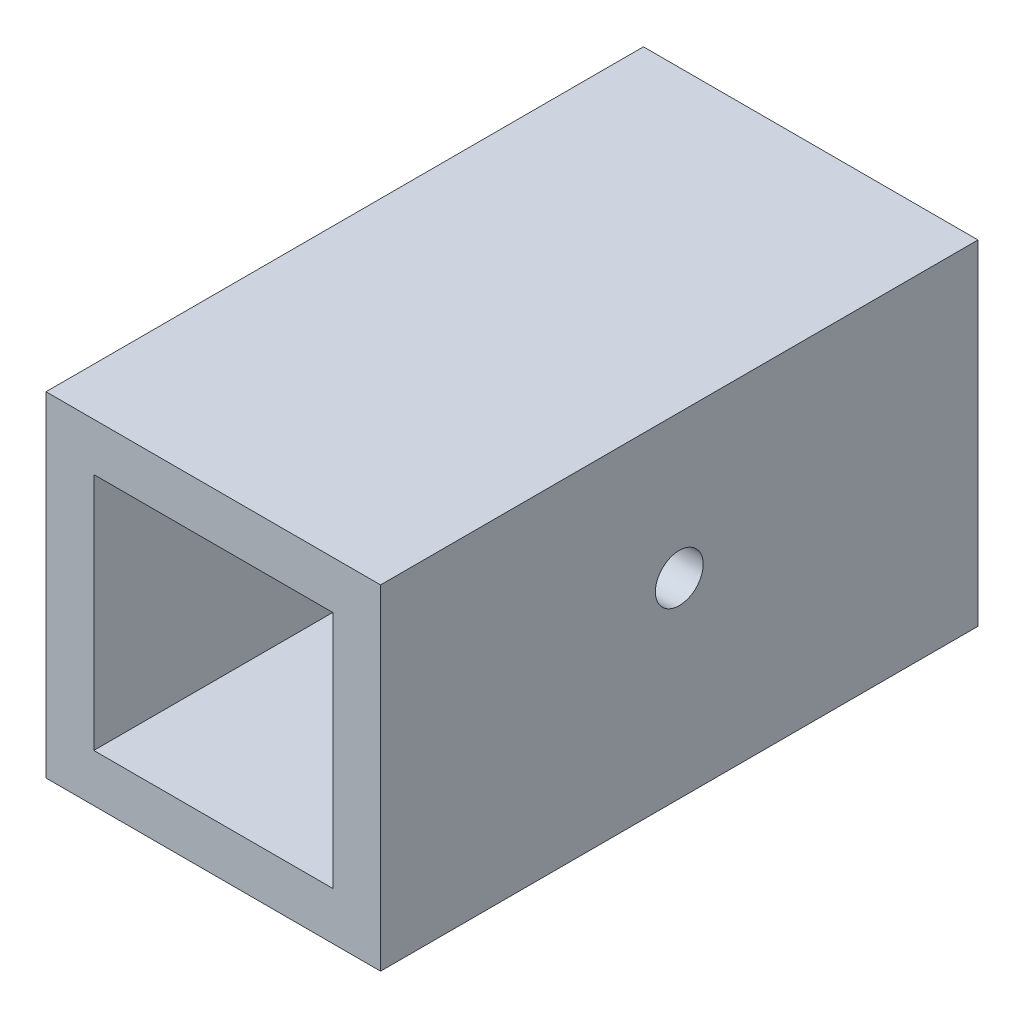
ISO-10303-21;
HEADER;
FILE_DESCRIPTION(('STEP AP214'),'2;1');
FILE_NAME('part.step','',(''),(''),'','','');
FILE_SCHEMA(('AUTOMOTIVE_DESIGN { 1 0 10303 214 1 1 1 1 }'));
ENDSEC;
DATA;
#1=APPLICATION_CONTEXT('core data for automotive mechanical design processes');
#2=APPLICATION_PROTOCOL_DEFINITION('international standard','automotive_design',2000,#1);
#3=PRODUCT_CONTEXT('',#1,'mechanical');
#4=PRODUCT('Part','Part','',(#3));
#5=PRODUCT_RELATED_PRODUCT_CATEGORY('part','',(#4));
#6=PRODUCT_DEFINITION_FORMATION('','',#4);
#7=PRODUCT_DEFINITION_CONTEXT('part definition',#1,'design');
#8=PRODUCT_DEFINITION('design','',#6,#7);
#9=PRODUCT_DEFINITION_SHAPE('','',#8);
#10=(LENGTH_UNIT() NAMED_UNIT(*) SI_UNIT(.MILLI.,.METRE.));
#11=(NAMED_UNIT(*) PLANE_ANGLE_UNIT() SI_UNIT($,.RADIAN.));
#12=(NAMED_UNIT(*) SI_UNIT($,.STERADIAN.) SOLID_ANGLE_UNIT());
#13=UNCERTAINTY_MEASURE_WITH_UNIT(LENGTH_MEASURE(1.E-05),#10,'distance_accuracy_value','');
#14=(GEOMETRIC_REPRESENTATION_CONTEXT(3) GLOBAL_UNCERTAINTY_ASSIGNED_CONTEXT((#13)) GLOBAL_UNIT_ASSIGNED_CONTEXT((#10,
#11,#12)) REPRESENTATION_CONTEXT('',''));
#15=CARTESIAN_POINT('',(0.,0.,0.));
#16=DIRECTION('',(0.,0.,1.));
#17=DIRECTION('',(1.,0.,0.));
#18=AXIS2_PLACEMENT_3D('',#15,#16,#17);
#19=CARTESIAN_POINT('',(0.,0.,0.));
#20=DIRECTION('',(0.,0.,-1.));
#21=DIRECTION('',(-1.,0.,0.));
#22=AXIS2_PLACEMENT_3D('',#19,#20,#21);
#23=PLANE('',#22);
#24=DIRECTION('',(0.,-1.,0.));
#25=VECTOR('',#24,1.);
#26=CARTESIAN_POINT('',(0.,0.,0.));
#27=LINE('',#26,#25);
#28=CARTESIAN_POINT('',(0.,14.,0.));
#29=VERTEX_POINT('',#28);
#30=CARTESIAN_POINT('',(0.,0.,0.));
#31=VERTEX_POINT('',#30);
#32=EDGE_CURVE('E240',#29,#31,#27,.T.);
#33=ORIENTED_EDGE('',*,*,#32,.F.);
#34=DIRECTION('',(-1.,0.,0.));
#35=VECTOR('',#34,1.);
#36=CARTESIAN_POINT('',(0.,14.,0.));
#37=LINE('',#36,#35);
#38=CARTESIAN_POINT('',(14.,14.,0.));
#39=VERTEX_POINT('',#38);
#40=EDGE_CURVE('E250',#39,#29,#37,.T.);
#41=ORIENTED_EDGE('',*,*,#40,.F.);
#42=DIRECTION('',(0.,1.,0.));
#43=VECTOR('',#42,1.);
#44=CARTESIAN_POINT('',(14.,0.,0.));
#45=LINE('',#44,#43);
#46=CARTESIAN_POINT('',(14.,0.,0.));
#47=VERTEX_POINT('',#46);
#48=EDGE_CURVE('E247',#47,#39,#45,.T.);
#49=ORIENTED_EDGE('',*,*,#48,.F.);
#50=DIRECTION('',(1.,0.,0.));
#51=VECTOR('',#50,1.);
#52=CARTESIAN_POINT('',(0.,0.,0.));
#53=LINE('',#52,#51);
#54=EDGE_CURVE('E244',#31,#47,#53,.T.);
#55=ORIENTED_EDGE('',*,*,#54,.F.);
#56=EDGE_LOOP('',(#33,#41,#49,#55));
#57=FACE_BOUND('',#56,.T.);
#58=DIRECTION('',(-1.,0.,0.));
#59=VECTOR('',#58,1.);
#60=CARTESIAN_POINT('',(2.,12.,0.));
#61=LINE('',#60,#59);
#62=CARTESIAN_POINT('',(12.,12.,0.));
#63=VERTEX_POINT('',#62);
#64=CARTESIAN_POINT('',(2.,12.,0.));
#65=VERTEX_POINT('',#64);
#66=EDGE_CURVE('E200',#63,#65,#61,.T.);
#67=ORIENTED_EDGE('',*,*,#66,.T.);
#68=DIRECTION('',(0.,-1.,0.));
#69=VECTOR('',#68,1.);
#70=CARTESIAN_POINT('',(2.,2.,0.));
#71=LINE('',#70,#69);
#72=CARTESIAN_POINT('',(2.,2.,0.));
#73=VERTEX_POINT('',#72);
#74=EDGE_CURVE('E194',#65,#73,#71,.T.);
#75=ORIENTED_EDGE('',*,*,#74,.T.);
#76=DIRECTION('',(1.,0.,0.));
#77=VECTOR('',#76,1.);
#78=CARTESIAN_POINT('',(2.,2.,0.));
#79=LINE('',#78,#77);
#80=CARTESIAN_POINT('',(12.,2.,0.));
#81=VERTEX_POINT('',#80);
#82=EDGE_CURVE('E216',#73,#81,#79,.T.);
#83=ORIENTED_EDGE('',*,*,#82,.T.);
#84=DIRECTION('',(0.,1.,0.));
#85=VECTOR('',#84,1.);
#86=CARTESIAN_POINT('',(12.,2.,0.));
#87=LINE('',#86,#85);
#88=EDGE_CURVE('E220',#81,#63,#87,.T.);
#89=ORIENTED_EDGE('',*,*,#88,.T.);
#90=EDGE_LOOP('',(#67,#75,#83,#89));
#91=FACE_BOUND('',#90,.T.);
#92=ADVANCED_FACE('F39',(#57,#91),#23,.T.);
#93=CARTESIAN_POINT('',(0.,0.,10.));
#94=DIRECTION('',(1.,0.,0.));
#95=DIRECTION('',(0.,0.,-1.));
#96=AXIS2_PLACEMENT_3D('',#93,#94,#95);
#97=PLANE('',#96);
#98=CARTESIAN_POINT('',(0.,8.,12.5));
#99=DIRECTION('',(1.,0.,0.));
#100=DIRECTION('',(0.,0.,-1.));
#101=AXIS2_PLACEMENT_3D('',#98,#99,#100);
#102=CIRCLE('',#101,1.);
#103=CARTESIAN_POINT('',(0.,8.,11.5));
#104=VERTEX_POINT('',#103);
#105=EDGE_CURVE('E163',#104,#104,#102,.T.);
#106=ORIENTED_EDGE('',*,*,#105,.T.);
#107=EDGE_LOOP('',(#106));
#108=FACE_BOUND('',#107,.T.);
#109=ORIENTED_EDGE('',*,*,#32,.T.);
#110=DIRECTION('',(0.,0.,-1.));
#111=VECTOR('',#110,1.);
#112=CARTESIAN_POINT('',(0.,0.,10.));
#113=LINE('',#112,#111);
#114=CARTESIAN_POINT('',(0.,0.,25.));
#115=VERTEX_POINT('',#114);
#116=EDGE_CURVE('E11',#115,#31,#113,.T.);
#117=ORIENTED_EDGE('',*,*,#116,.F.);
#118=DIRECTION('',(0.,-1.,0.));
#119=VECTOR('',#118,1.);
#120=CARTESIAN_POINT('',(0.,14.,25.));
#121=LINE('',#120,#119);
#122=CARTESIAN_POINT('',(0.,14.,25.));
#123=VERTEX_POINT('',#122);
#124=EDGE_CURVE('E145',#123,#115,#121,.T.);
#125=ORIENTED_EDGE('',*,*,#124,.F.);
#126=DIRECTION('',(0.,0.,-1.));
#127=VECTOR('',#126,1.);
#128=CARTESIAN_POINT('',(0.,14.,10.));
#129=LINE('',#128,#127);
#130=EDGE_CURVE('E253',#123,#29,#129,.T.);
#131=ORIENTED_EDGE('',*,*,#130,.T.);
#132=EDGE_LOOP('',(#109,#117,#125,#131));
#133=FACE_BOUND('',#132,.T.);
#134=ADVANCED_FACE('F41',(#108,#133),#97,.F.);
#135=CARTESIAN_POINT('',(0.,0.,10.));
#136=DIRECTION('',(0.,1.,0.));
#137=DIRECTION('',(0.,0.,1.));
#138=AXIS2_PLACEMENT_3D('',#135,#136,#137);
#139=PLANE('',#138);
#140=ORIENTED_EDGE('',*,*,#54,.T.);
#141=DIRECTION('',(0.,0.,-1.));
#142=VECTOR('',#141,1.);
#143=CARTESIAN_POINT('',(14.,0.,10.));
#144=LINE('',#143,#142);
#145=CARTESIAN_POINT('',(14.,0.,25.));
#146=VERTEX_POINT('',#145);
#147=EDGE_CURVE('E48',#146,#47,#144,.T.);
#148=ORIENTED_EDGE('',*,*,#147,.F.);
#149=DIRECTION('',(1.,0.,0.));
#150=VECTOR('',#149,1.);
#151=CARTESIAN_POINT('',(0.,0.,25.));
#152=LINE('',#151,#150);
#153=EDGE_CURVE('E182',#115,#146,#152,.T.);
#154=ORIENTED_EDGE('',*,*,#153,.F.);
#155=ORIENTED_EDGE('',*,*,#116,.T.);
#156=EDGE_LOOP('',(#140,#148,#154,#155));
#157=FACE_BOUND('',#156,.T.);
#158=ADVANCED_FACE('F278',(#157),#139,.F.);
#159=CARTESIAN_POINT('',(14.,0.,10.));
#160=DIRECTION('',(-1.,0.,0.));
#161=DIRECTION('',(0.,0.,1.));
#162=AXIS2_PLACEMENT_3D('',#159,#160,#161);
#163=PLANE('',#162);
#164=CARTESIAN_POINT('',(14.,8.,12.5));
#165=DIRECTION('',(1.,0.,0.));
#166=DIRECTION('',(0.,0.,-1.));
#167=AXIS2_PLACEMENT_3D('',#164,#165,#166);
#168=CIRCLE('',#167,1.);
#169=CARTESIAN_POINT('',(14.,8.,11.5));
#170=VERTEX_POINT('',#169);
#171=EDGE_CURVE('E431',#170,#170,#168,.T.);
#172=ORIENTED_EDGE('',*,*,#171,.F.);
#173=EDGE_LOOP('',(#172));
#174=FACE_BOUND('',#173,.T.);
#175=ORIENTED_EDGE('',*,*,#48,.T.);
#176=DIRECTION('',(0.,0.,-1.));
#177=VECTOR('',#176,1.);
#178=CARTESIAN_POINT('',(14.,14.,10.));
#179=LINE('',#178,#177);
#180=CARTESIAN_POINT('',(14.,14.,25.));
#181=VERTEX_POINT('',#180);
#182=EDGE_CURVE('E257',#181,#39,#179,.T.);
#183=ORIENTED_EDGE('',*,*,#182,.F.);
#184=DIRECTION('',(0.,1.,0.));
#185=VECTOR('',#184,1.);
#186=CARTESIAN_POINT('',(14.,14.,25.));
#187=LINE('',#186,#185);
#188=EDGE_CURVE('E186',#146,#181,#187,.T.);
#189=ORIENTED_EDGE('',*,*,#188,.F.);
#190=ORIENTED_EDGE('',*,*,#147,.T.);
#191=EDGE_LOOP('',(#175,#183,#189,#190));
#192=FACE_BOUND('',#191,.T.);
#193=ADVANCED_FACE('F265',(#174,#192),#163,.F.);
#194=CARTESIAN_POINT('',(0.,14.,10.));
#195=DIRECTION('',(0.,-1.,0.));
#196=DIRECTION('',(0.,0.,-1.));
#197=AXIS2_PLACEMENT_3D('',#194,#195,#196);
#198=PLANE('',#197);
#199=ORIENTED_EDGE('',*,*,#40,.T.);
#200=ORIENTED_EDGE('',*,*,#130,.F.);
#201=DIRECTION('',(-1.,0.,0.));
#202=VECTOR('',#201,1.);
#203=CARTESIAN_POINT('',(0.,14.,25.));
#204=LINE('',#203,#202);
#205=EDGE_CURVE('E190',#181,#123,#204,.T.);
#206=ORIENTED_EDGE('',*,*,#205,.F.);
#207=ORIENTED_EDGE('',*,*,#182,.T.);
#208=EDGE_LOOP('',(#199,#200,#206,#207));
#209=FACE_BOUND('',#208,.T.);
#210=ADVANCED_FACE('F273',(#209),#198,.F.);
#211=CARTESIAN_POINT('',(2.,2.,10.));
#212=DIRECTION('',(1.,0.,0.));
#213=DIRECTION('',(0.,0.,-1.));
#214=AXIS2_PLACEMENT_3D('',#211,#212,#213);
#215=PLANE('',#214);
#216=ORIENTED_EDGE('',*,*,#74,.F.);
#217=DIRECTION('',(0.,0.,-1.));
#218=VECTOR('',#217,1.);
#219=CARTESIAN_POINT('',(2.,12.,10.));
#220=LINE('',#219,#218);
#221=CARTESIAN_POINT('',(2.,12.,10.));
#222=VERTEX_POINT('',#221);
#223=EDGE_CURVE('E212',#222,#65,#220,.T.);
#224=ORIENTED_EDGE('',*,*,#223,.F.);
#225=DIRECTION('',(0.,-1.,0.));
#226=VECTOR('',#225,1.);
#227=CARTESIAN_POINT('',(2.,2.,10.));
#228=LINE('',#227,#226);
#229=CARTESIAN_POINT('',(2.,2.,10.));
#230=VERTEX_POINT('',#229);
#231=EDGE_CURVE('E195',#222,#230,#228,.T.);
#232=ORIENTED_EDGE('',*,*,#231,.T.);
#233=DIRECTION('',(0.,0.,-1.));
#234=VECTOR('',#233,1.);
#235=CARTESIAN_POINT('',(2.,2.,10.));
#236=LINE('',#235,#234);
#237=EDGE_CURVE('E236',#230,#73,#236,.T.);
#238=ORIENTED_EDGE('',*,*,#237,.T.);
#239=EDGE_LOOP('',(#216,#224,#232,#238));
#240=FACE_BOUND('',#239,.T.);
#241=ADVANCED_FACE('F293',(#240),#215,.T.);
#242=CARTESIAN_POINT('',(2.,2.,10.));
#243=DIRECTION('',(0.,1.,0.));
#244=DIRECTION('',(0.,0.,1.));
#245=AXIS2_PLACEMENT_3D('',#242,#243,#244);
#246=PLANE('',#245);
#247=ORIENTED_EDGE('',*,*,#82,.F.);
#248=ORIENTED_EDGE('',*,*,#237,.F.);
#249=DIRECTION('',(1.,0.,0.));
#250=VECTOR('',#249,1.);
#251=CARTESIAN_POINT('',(2.,2.,10.));
#252=LINE('',#251,#250);
#253=CARTESIAN_POINT('',(12.,2.,10.));
#254=VERTEX_POINT('',#253);
#255=EDGE_CURVE('E199',#230,#254,#252,.T.);
#256=ORIENTED_EDGE('',*,*,#255,.T.);
#257=DIRECTION('',(0.,0.,-1.));
#258=VECTOR('',#257,1.);
#259=CARTESIAN_POINT('',(12.,2.,10.));
#260=LINE('',#259,#258);
#261=EDGE_CURVE('E233',#254,#81,#260,.T.);
#262=ORIENTED_EDGE('',*,*,#261,.T.);
#263=EDGE_LOOP('',(#247,#248,#256,#262));
#264=FACE_BOUND('',#263,.T.);
#265=ADVANCED_FACE('F299',(#264),#246,.T.);
#266=CARTESIAN_POINT('',(12.,2.,10.));
#267=DIRECTION('',(-1.,0.,0.));
#268=DIRECTION('',(0.,0.,1.));
#269=AXIS2_PLACEMENT_3D('',#266,#267,#268);
#270=PLANE('',#269);
#271=ORIENTED_EDGE('',*,*,#88,.F.);
#272=ORIENTED_EDGE('',*,*,#261,.F.);
#273=DIRECTION('',(0.,1.,0.));
#274=VECTOR('',#273,1.);
#275=CARTESIAN_POINT('',(12.,2.,10.));
#276=LINE('',#275,#274);
#277=CARTESIAN_POINT('',(12.,12.,10.));
#278=VERTEX_POINT('',#277);
#279=EDGE_CURVE('E204',#254,#278,#276,.T.);
#280=ORIENTED_EDGE('',*,*,#279,.T.);
#281=DIRECTION('',(0.,0.,-1.));
#282=VECTOR('',#281,1.);
#283=CARTESIAN_POINT('',(12.,12.,10.));
#284=LINE('',#283,#282);
#285=EDGE_CURVE('E230',#278,#63,#284,.T.);
#286=ORIENTED_EDGE('',*,*,#285,.T.);
#287=EDGE_LOOP('',(#271,#272,#280,#286));
#288=FACE_BOUND('',#287,.T.);
#289=ADVANCED_FACE('F304',(#288),#270,.T.);
#290=CARTESIAN_POINT('',(2.,12.,10.));
#291=DIRECTION('',(0.,-1.,0.));
#292=DIRECTION('',(0.,0.,-1.));
#293=AXIS2_PLACEMENT_3D('',#290,#291,#292);
#294=PLANE('',#293);
#295=ORIENTED_EDGE('',*,*,#66,.F.);
#296=ORIENTED_EDGE('',*,*,#285,.F.);
#297=DIRECTION('',(-1.,0.,0.));
#298=VECTOR('',#297,1.);
#299=CARTESIAN_POINT('',(2.,12.,10.));
#300=LINE('',#299,#298);
#301=EDGE_CURVE('E208',#278,#222,#300,.T.);
#302=ORIENTED_EDGE('',*,*,#301,.T.);
#303=ORIENTED_EDGE('',*,*,#223,.T.);
#304=EDGE_LOOP('',(#295,#296,#302,#303));
#305=FACE_BOUND('',#304,.T.);
#306=ADVANCED_FACE('F310',(#305),#294,.T.);
#307=CARTESIAN_POINT('',(0.,0.,10.));
#308=DIRECTION('',(0.,0.,1.));
#309=DIRECTION('',(1.,0.,0.));
#310=AXIS2_PLACEMENT_3D('',#307,#308,#309);
#311=PLANE('',#310);
#312=ORIENTED_EDGE('',*,*,#231,.F.);
#313=ORIENTED_EDGE('',*,*,#301,.F.);
#314=ORIENTED_EDGE('',*,*,#279,.F.);
#315=ORIENTED_EDGE('',*,*,#255,.F.);
#316=EDGE_LOOP('',(#312,#313,#314,#315));
#317=FACE_BOUND('',#316,.T.);
#318=ADVANCED_FACE('F316',(#317),#311,.F.);
#319=CARTESIAN_POINT('',(0.,0.,25.));
#320=DIRECTION('',(0.,0.,1.));
#321=DIRECTION('',(1.,0.,0.));
#322=AXIS2_PLACEMENT_3D('',#319,#320,#321);
#323=PLANE('',#322);
#324=ORIENTED_EDGE('',*,*,#124,.T.);
#325=ORIENTED_EDGE('',*,*,#153,.T.);
#326=ORIENTED_EDGE('',*,*,#188,.T.);
#327=ORIENTED_EDGE('',*,*,#205,.T.);
#328=EDGE_LOOP('',(#324,#325,#326,#327));
#329=FACE_BOUND('',#328,.T.);
#330=DIRECTION('',(1.,0.,0.));
#331=VECTOR('',#330,1.);
#332=CARTESIAN_POINT('',(2.,2.,25.));
#333=LINE('',#332,#331);
#334=CARTESIAN_POINT('',(2.,2.,25.));
#335=VERTEX_POINT('',#334);
#336=CARTESIAN_POINT('',(12.,2.,25.));
#337=VERTEX_POINT('',#336);
#338=EDGE_CURVE('E138',#335,#337,#333,.T.);
#339=ORIENTED_EDGE('',*,*,#338,.F.);
#340=DIRECTION('',(0.,-1.,0.));
#341=VECTOR('',#340,1.);
#342=CARTESIAN_POINT('',(2.,12.,25.));
#343=LINE('',#342,#341);
#344=CARTESIAN_POINT('',(2.,12.,25.));
#345=VERTEX_POINT('',#344);
#346=EDGE_CURVE('E128',#345,#335,#343,.T.);
#347=ORIENTED_EDGE('',*,*,#346,.F.);
#348=DIRECTION('',(-1.,0.,0.));
#349=VECTOR('',#348,1.);
#350=CARTESIAN_POINT('',(2.,12.,25.));
#351=LINE('',#350,#349);
#352=CARTESIAN_POINT('',(12.,12.,25.));
#353=VERTEX_POINT('',#352);
#354=EDGE_CURVE('E155',#353,#345,#351,.T.);
#355=ORIENTED_EDGE('',*,*,#354,.F.);
#356=DIRECTION('',(0.,1.,0.));
#357=VECTOR('',#356,1.);
#358=CARTESIAN_POINT('',(12.,12.,25.));
#359=LINE('',#358,#357);
#360=EDGE_CURVE('E151',#337,#353,#359,.T.);
#361=ORIENTED_EDGE('',*,*,#360,.F.);
#362=EDGE_LOOP('',(#339,#347,#355,#361));
#363=FACE_BOUND('',#362,.T.);
#364=ADVANCED_FACE('F149',(#329,#363),#323,.T.);
#365=CARTESIAN_POINT('',(2.,12.,25.));
#366=DIRECTION('',(1.,0.,0.));
#367=DIRECTION('',(0.,1.,0.));
#368=AXIS2_PLACEMENT_3D('',#365,#366,#367);
#369=PLANE('',#368);
#370=DIRECTION('',(0.,-1.,0.));
#371=VECTOR('',#370,1.);
#372=CARTESIAN_POINT('',(2.,12.,15.));
#373=LINE('',#372,#371);
#374=CARTESIAN_POINT('',(2.,12.,15.));
#375=VERTEX_POINT('',#374);
#376=CARTESIAN_POINT('',(2.,2.,15.));
#377=VERTEX_POINT('',#376);
#378=EDGE_CURVE('E55',#375,#377,#373,.T.);
#379=ORIENTED_EDGE('',*,*,#378,.F.);
#380=DIRECTION('',(0.,0.,-1.));
#381=VECTOR('',#380,1.);
#382=CARTESIAN_POINT('',(2.,12.,25.));
#383=LINE('',#382,#381);
#384=EDGE_CURVE('E133',#345,#375,#383,.T.);
#385=ORIENTED_EDGE('',*,*,#384,.F.);
#386=ORIENTED_EDGE('',*,*,#346,.T.);
#387=DIRECTION('',(0.,0.,-1.));
#388=VECTOR('',#387,1.);
#389=CARTESIAN_POINT('',(2.,2.,25.));
#390=LINE('',#389,#388);
#391=EDGE_CURVE('E131',#335,#377,#390,.T.);
#392=ORIENTED_EDGE('',*,*,#391,.T.);
#393=EDGE_LOOP('',(#379,#385,#386,#392));
#394=FACE_BOUND('',#393,.T.);
#395=ADVANCED_FACE('F130',(#394),#369,.T.);
#396=CARTESIAN_POINT('',(2.,2.,25.));
#397=DIRECTION('',(0.,1.,0.));
#398=DIRECTION('',(0.,0.,1.));
#399=AXIS2_PLACEMENT_3D('',#396,#397,#398);
#400=PLANE('',#399);
#401=DIRECTION('',(1.,0.,0.));
#402=VECTOR('',#401,1.);
#403=CARTESIAN_POINT('',(2.,2.,15.));
#404=LINE('',#403,#402);
#405=CARTESIAN_POINT('',(12.,2.,15.));
#406=VERTEX_POINT('',#405);
#407=EDGE_CURVE('E59',#377,#406,#404,.T.);
#408=ORIENTED_EDGE('',*,*,#407,.F.);
#409=ORIENTED_EDGE('',*,*,#391,.F.);
#410=ORIENTED_EDGE('',*,*,#338,.T.);
#411=DIRECTION('',(0.,0.,-1.));
#412=VECTOR('',#411,1.);
#413=CARTESIAN_POINT('',(12.,2.,25.));
#414=LINE('',#413,#412);
#415=EDGE_CURVE('E146',#337,#406,#414,.T.);
#416=ORIENTED_EDGE('',*,*,#415,.T.);
#417=EDGE_LOOP('',(#408,#409,#410,#416));
#418=FACE_BOUND('',#417,.T.);
#419=ADVANCED_FACE('F142',(#418),#400,.T.);
#420=CARTESIAN_POINT('',(12.,12.,25.));
#421=DIRECTION('',(-1.,0.,0.));
#422=DIRECTION('',(0.,-1.,0.));
#423=AXIS2_PLACEMENT_3D('',#420,#421,#422);
#424=PLANE('',#423);
#425=DIRECTION('',(0.,1.,0.));
#426=VECTOR('',#425,1.);
#427=CARTESIAN_POINT('',(12.,12.,15.));
#428=LINE('',#427,#426);
#429=CARTESIAN_POINT('',(12.,12.,15.));
#430=VERTEX_POINT('',#429);
#431=EDGE_CURVE('E166',#406,#430,#428,.T.);
#432=ORIENTED_EDGE('',*,*,#431,.F.);
#433=ORIENTED_EDGE('',*,*,#415,.F.);
#434=ORIENTED_EDGE('',*,*,#360,.T.);
#435=DIRECTION('',(0.,0.,-1.));
#436=VECTOR('',#435,1.);
#437=CARTESIAN_POINT('',(12.,12.,25.));
#438=LINE('',#437,#436);
#439=EDGE_CURVE('E173',#353,#430,#438,.T.);
#440=ORIENTED_EDGE('',*,*,#439,.T.);
#441=EDGE_LOOP('',(#432,#433,#434,#440));
#442=FACE_BOUND('',#441,.T.);
#443=ADVANCED_FACE('F378',(#442),#424,.T.);
#444=CARTESIAN_POINT('',(2.,12.,25.));
#445=DIRECTION('',(0.,-1.,0.));
#446=DIRECTION('',(0.,0.,-1.));
#447=AXIS2_PLACEMENT_3D('',#444,#445,#446);
#448=PLANE('',#447);
#449=DIRECTION('',(-1.,0.,0.));
#450=VECTOR('',#449,1.);
#451=CARTESIAN_POINT('',(2.,12.,15.));
#452=LINE('',#451,#450);
#453=EDGE_CURVE('E139',#430,#375,#452,.T.);
#454=ORIENTED_EDGE('',*,*,#453,.F.);
#455=ORIENTED_EDGE('',*,*,#439,.F.);
#456=ORIENTED_EDGE('',*,*,#354,.T.);
#457=ORIENTED_EDGE('',*,*,#384,.T.);
#458=EDGE_LOOP('',(#454,#455,#456,#457));
#459=FACE_BOUND('',#458,.T.);
#460=ADVANCED_FACE('F387',(#459),#448,.T.);
#461=CARTESIAN_POINT('',(0.,0.,15.));
#462=DIRECTION('',(0.,0.,1.));
#463=DIRECTION('',(1.,0.,0.));
#464=AXIS2_PLACEMENT_3D('',#461,#462,#463);
#465=PLANE('',#464);
#466=ORIENTED_EDGE('',*,*,#378,.T.);
#467=ORIENTED_EDGE('',*,*,#407,.T.);
#468=ORIENTED_EDGE('',*,*,#431,.T.);
#469=ORIENTED_EDGE('',*,*,#453,.T.);
#470=EDGE_LOOP('',(#466,#467,#468,#469));
#471=FACE_BOUND('',#470,.T.);
#472=ADVANCED_FACE('F326',(#471),#465,.T.);
#473=CARTESIAN_POINT('',(-2.,8.,12.5));
#474=DIRECTION('',(1.,0.,0.));
#475=DIRECTION('',(0.,0.,-1.));
#476=AXIS2_PLACEMENT_3D('',#473,#474,#475);
#477=CYLINDRICAL_SURFACE('',#476,1.);
#478=ORIENTED_EDGE('',*,*,#171,.T.);
#479=EDGE_LOOP('',(#478));
#480=FACE_BOUND('',#479,.T.);
#481=ORIENTED_EDGE('',*,*,#105,.F.);
#482=EDGE_LOOP('',(#481));
#483=FACE_BOUND('',#482,.T.);
#484=ADVANCED_FACE('F406',(#480,#483),#477,.F.);
#485=CLOSED_SHELL('',(#92,#134,#158,#193,#210,#241,#265,#289,#306,#318,#364,#395,#419,#443,#460,
#472,#484));
#486=MANIFOLD_SOLID_BREP('B2',#485);
#487=ADVANCED_BREP_SHAPE_REPRESENTATION('',(#18,#486),#14);
#488=SHAPE_DEFINITION_REPRESENTATION(#9,#487);
ENDSEC;
END-ISO-10303-21;
